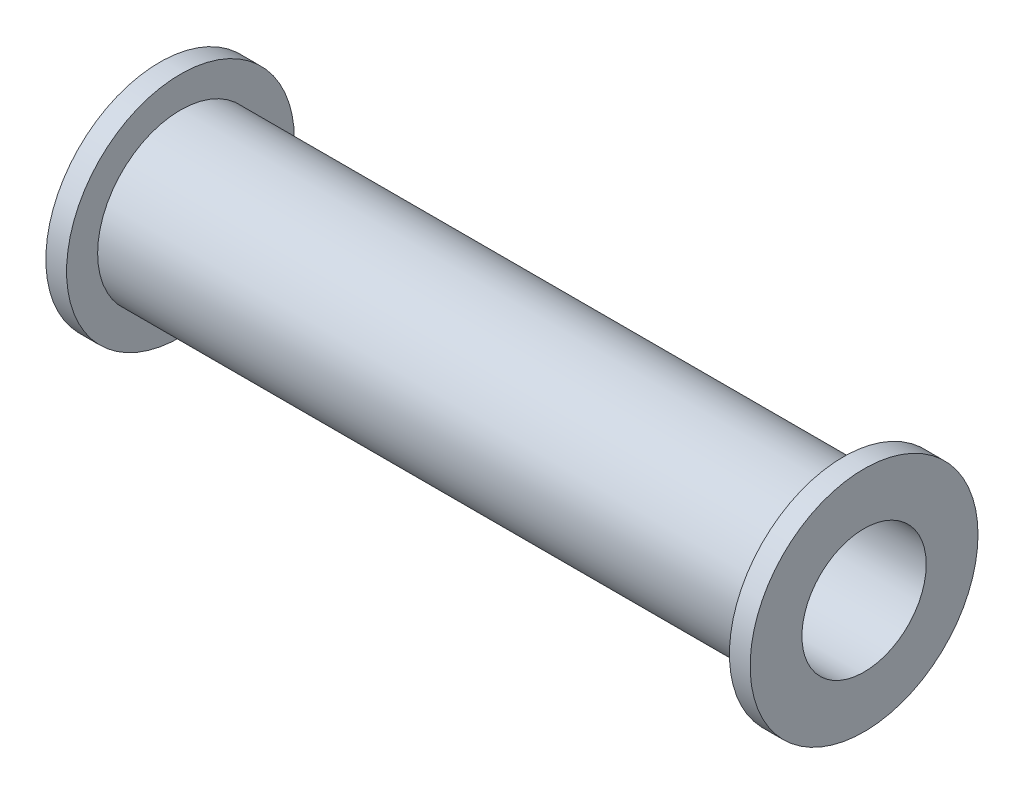
ISO-10303-21;
HEADER;
FILE_DESCRIPTION(('STEP AP214'),'2;1');
FILE_NAME('part.step','',(''),(''),'','','');
FILE_SCHEMA(('AUTOMOTIVE_DESIGN { 1 0 10303 214 1 1 1 1 }'));
ENDSEC;
DATA;
#1=APPLICATION_CONTEXT('core data for automotive mechanical design processes');
#2=APPLICATION_PROTOCOL_DEFINITION('international standard','automotive_design',2000,#1);
#3=PRODUCT_CONTEXT('',#1,'mechanical');
#4=PRODUCT('Part','Part','',(#3));
#5=PRODUCT_RELATED_PRODUCT_CATEGORY('part','',(#4));
#6=PRODUCT_DEFINITION_FORMATION('','',#4);
#7=PRODUCT_DEFINITION_CONTEXT('part definition',#1,'design');
#8=PRODUCT_DEFINITION('design','',#6,#7);
#9=PRODUCT_DEFINITION_SHAPE('','',#8);
#10=(LENGTH_UNIT() NAMED_UNIT(*) SI_UNIT(.MILLI.,.METRE.));
#11=(NAMED_UNIT(*) PLANE_ANGLE_UNIT() SI_UNIT($,.RADIAN.));
#12=(NAMED_UNIT(*) SI_UNIT($,.STERADIAN.) SOLID_ANGLE_UNIT());
#13=UNCERTAINTY_MEASURE_WITH_UNIT(LENGTH_MEASURE(1.E-05),#10,'distance_accuracy_value','');
#14=(GEOMETRIC_REPRESENTATION_CONTEXT(3) GLOBAL_UNCERTAINTY_ASSIGNED_CONTEXT((#13)) GLOBAL_UNIT_ASSIGNED_CONTEXT((#10,
#11,#12)) REPRESENTATION_CONTEXT('',''));
#15=CARTESIAN_POINT('',(0.,0.,0.));
#16=DIRECTION('',(0.,0.,1.));
#17=DIRECTION('',(1.,0.,0.));
#18=AXIS2_PLACEMENT_3D('',#15,#16,#17);
#19=CARTESIAN_POINT('',(1.5875,0.,0.));
#20=DIRECTION('',(-1.,0.,0.));
#21=DIRECTION('',(0.,0.,1.));
#22=AXIS2_PLACEMENT_3D('',#19,#20,#21);
#23=CYLINDRICAL_SURFACE('',#22,8.73125);
#24=CARTESIAN_POINT('',(1.5875,0.,0.));
#25=DIRECTION('',(1.,0.,0.));
#26=DIRECTION('',(0.,0.,-1.));
#27=AXIS2_PLACEMENT_3D('',#24,#25,#26);
#28=CIRCLE('',#27,8.73125);
#29=CARTESIAN_POINT('',(1.5875,0.,-8.73125));
#30=VERTEX_POINT('',#29);
#31=EDGE_CURVE('E40',#30,#30,#28,.T.);
#32=ORIENTED_EDGE('',*,*,#31,.F.);
#33=EDGE_LOOP('',(#32));
#34=FACE_BOUND('',#33,.T.);
#35=CARTESIAN_POINT('',(0.,0.,0.));
#36=DIRECTION('',(1.,0.,0.));
#37=DIRECTION('',(0.,0.,-1.));
#38=AXIS2_PLACEMENT_3D('',#35,#36,#37);
#39=CIRCLE('',#38,8.73125);
#40=CARTESIAN_POINT('',(0.,0.,-8.73125));
#41=VERTEX_POINT('',#40);
#42=EDGE_CURVE('E36',#41,#41,#39,.T.);
#43=ORIENTED_EDGE('',*,*,#42,.T.);
#44=EDGE_LOOP('',(#43));
#45=FACE_BOUND('',#44,.T.);
#46=ADVANCED_FACE('F33',(#34,#45),#23,.T.);
#47=CARTESIAN_POINT('',(1.5875,0.,0.));
#48=DIRECTION('',(1.,0.,0.));
#49=DIRECTION('',(0.,0.,-1.));
#50=AXIS2_PLACEMENT_3D('',#47,#48,#49);
#51=PLANE('',#50);
#52=CARTESIAN_POINT('',(1.5875,0.,0.));
#53=DIRECTION('',(1.,0.,0.));
#54=DIRECTION('',(0.,0.,-1.));
#55=AXIS2_PLACEMENT_3D('',#52,#53,#54);
#56=CIRCLE('',#55,6.35);
#57=CARTESIAN_POINT('',(1.5875,0.,-6.35));
#58=VERTEX_POINT('',#57);
#59=EDGE_CURVE('E10',#58,#58,#56,.T.);
#60=ORIENTED_EDGE('',*,*,#59,.F.);
#61=EDGE_LOOP('',(#60));
#62=FACE_BOUND('',#61,.T.);
#63=ORIENTED_EDGE('',*,*,#31,.T.);
#64=EDGE_LOOP('',(#63));
#65=FACE_BOUND('',#64,.T.);
#66=ADVANCED_FACE('F91',(#62,#65),#51,.T.);
#67=CARTESIAN_POINT('',(0.,0.,0.));
#68=DIRECTION('',(1.,0.,0.));
#69=DIRECTION('',(0.,0.,-1.));
#70=AXIS2_PLACEMENT_3D('',#67,#68,#69);
#71=PLANE('',#70);
#72=CARTESIAN_POINT('',(0.,0.,0.));
#73=DIRECTION('',(1.,0.,0.));
#74=DIRECTION('',(0.,0.,-1.));
#75=AXIS2_PLACEMENT_3D('',#72,#73,#74);
#76=CIRCLE('',#75,4.7625);
#77=CARTESIAN_POINT('',(0.,0.,-4.7625));
#78=VERTEX_POINT('',#77);
#79=EDGE_CURVE('E53',#78,#78,#76,.T.);
#80=ORIENTED_EDGE('',*,*,#79,.T.);
#81=EDGE_LOOP('',(#80));
#82=FACE_BOUND('',#81,.T.);
#83=ORIENTED_EDGE('',*,*,#42,.F.);
#84=EDGE_LOOP('',(#83));
#85=FACE_BOUND('',#84,.T.);
#86=ADVANCED_FACE('F62',(#82,#85),#71,.F.);
#87=CARTESIAN_POINT('',(52.3875,0.,0.));
#88=DIRECTION('',(-1.,0.,0.));
#89=DIRECTION('',(0.,0.,1.));
#90=AXIS2_PLACEMENT_3D('',#87,#88,#89);
#91=CYLINDRICAL_SURFACE('',#90,6.35);
#92=CARTESIAN_POINT('',(52.3875,0.,0.));
#93=DIRECTION('',(1.,0.,0.));
#94=DIRECTION('',(0.,0.,-1.));
#95=AXIS2_PLACEMENT_3D('',#92,#93,#94);
#96=CIRCLE('',#95,6.35);
#97=CARTESIAN_POINT('',(52.3875,0.,-6.35));
#98=VERTEX_POINT('',#97);
#99=EDGE_CURVE('E46',#98,#98,#96,.T.);
#100=ORIENTED_EDGE('',*,*,#99,.F.);
#101=EDGE_LOOP('',(#100));
#102=FACE_BOUND('',#101,.T.);
#103=ORIENTED_EDGE('',*,*,#59,.T.);
#104=EDGE_LOOP('',(#103));
#105=FACE_BOUND('',#104,.T.);
#106=ADVANCED_FACE('F81',(#102,#105),#91,.T.);
#107=CARTESIAN_POINT('',(53.975,0.,0.));
#108=DIRECTION('',(-1.,0.,0.));
#109=DIRECTION('',(0.,0.,1.));
#110=AXIS2_PLACEMENT_3D('',#107,#108,#109);
#111=CYLINDRICAL_SURFACE('',#110,8.73125);
#112=CARTESIAN_POINT('',(53.975,0.,0.));
#113=DIRECTION('',(1.,0.,0.));
#114=DIRECTION('',(0.,0.,-1.));
#115=AXIS2_PLACEMENT_3D('',#112,#113,#114);
#116=CIRCLE('',#115,8.73125);
#117=CARTESIAN_POINT('',(53.975,0.,-8.73125));
#118=VERTEX_POINT('',#117);
#119=EDGE_CURVE('E49',#118,#118,#116,.T.);
#120=ORIENTED_EDGE('',*,*,#119,.F.);
#121=EDGE_LOOP('',(#120));
#122=FACE_BOUND('',#121,.T.);
#123=CARTESIAN_POINT('',(52.3875,0.,0.));
#124=DIRECTION('',(1.,0.,0.));
#125=DIRECTION('',(0.,0.,-1.));
#126=AXIS2_PLACEMENT_3D('',#123,#124,#125);
#127=CIRCLE('',#126,8.73125);
#128=CARTESIAN_POINT('',(52.3875,0.,-8.73125));
#129=VERTEX_POINT('',#128);
#130=EDGE_CURVE('E50',#129,#129,#127,.T.);
#131=ORIENTED_EDGE('',*,*,#130,.T.);
#132=EDGE_LOOP('',(#131));
#133=FACE_BOUND('',#132,.T.);
#134=ADVANCED_FACE('F75',(#122,#133),#111,.T.);
#135=CARTESIAN_POINT('',(53.975,0.,0.));
#136=DIRECTION('',(1.,0.,0.));
#137=DIRECTION('',(0.,0.,-1.));
#138=AXIS2_PLACEMENT_3D('',#135,#136,#137);
#139=PLANE('',#138);
#140=CARTESIAN_POINT('',(53.975,0.,0.));
#141=DIRECTION('',(1.,0.,0.));
#142=DIRECTION('',(0.,0.,-1.));
#143=AXIS2_PLACEMENT_3D('',#140,#141,#142);
#144=CIRCLE('',#143,4.7625);
#145=CARTESIAN_POINT('',(53.975,0.,-4.7625));
#146=VERTEX_POINT('',#145);
#147=EDGE_CURVE('E56',#146,#146,#144,.T.);
#148=ORIENTED_EDGE('',*,*,#147,.F.);
#149=EDGE_LOOP('',(#148));
#150=FACE_BOUND('',#149,.T.);
#151=ORIENTED_EDGE('',*,*,#119,.T.);
#152=EDGE_LOOP('',(#151));
#153=FACE_BOUND('',#152,.T.);
#154=ADVANCED_FACE('F72',(#150,#153),#139,.T.);
#155=CARTESIAN_POINT('',(52.3875,0.,0.));
#156=DIRECTION('',(1.,0.,0.));
#157=DIRECTION('',(0.,0.,-1.));
#158=AXIS2_PLACEMENT_3D('',#155,#156,#157);
#159=PLANE('',#158);
#160=ORIENTED_EDGE('',*,*,#99,.T.);
#161=EDGE_LOOP('',(#160));
#162=FACE_BOUND('',#161,.T.);
#163=ORIENTED_EDGE('',*,*,#130,.F.);
#164=EDGE_LOOP('',(#163));
#165=FACE_BOUND('',#164,.T.);
#166=ADVANCED_FACE('F68',(#162,#165),#159,.F.);
#167=CARTESIAN_POINT('',(0.,0.,0.));
#168=DIRECTION('',(1.,0.,0.));
#169=DIRECTION('',(0.,0.,-1.));
#170=AXIS2_PLACEMENT_3D('',#167,#168,#169);
#171=CYLINDRICAL_SURFACE('',#170,4.7625);
#172=ORIENTED_EDGE('',*,*,#79,.F.);
#173=EDGE_LOOP('',(#172));
#174=FACE_BOUND('',#173,.T.);
#175=ORIENTED_EDGE('',*,*,#147,.T.);
#176=EDGE_LOOP('',(#175));
#177=FACE_BOUND('',#176,.T.);
#178=ADVANCED_FACE('F65',(#174,#177),#171,.F.);
#179=CLOSED_SHELL('',(#46,#66,#86,#106,#134,#154,#166,#178));
#180=MANIFOLD_SOLID_BREP('B2',#179);
#181=ADVANCED_BREP_SHAPE_REPRESENTATION('',(#18,#180),#14);
#182=SHAPE_DEFINITION_REPRESENTATION(#9,#181);
ENDSEC;
END-ISO-10303-21;
